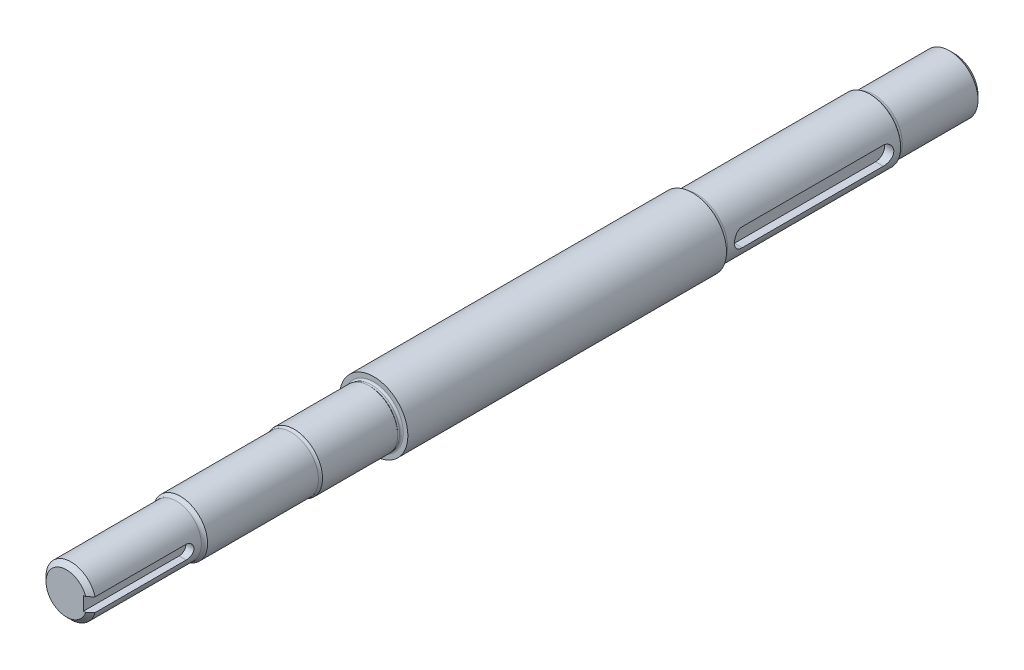
ISO-10303-21;
HEADER;
FILE_DESCRIPTION(('STEP AP214'),'2;1');
FILE_NAME('part.step','',(''),(''),'','','');
FILE_SCHEMA(('AUTOMOTIVE_DESIGN { 1 0 10303 214 1 1 1 1 }'));
ENDSEC;
DATA;
#1=APPLICATION_CONTEXT('core data for automotive mechanical design processes');
#2=APPLICATION_PROTOCOL_DEFINITION('international standard','automotive_design',2000,#1);
#3=PRODUCT_CONTEXT('',#1,'mechanical');
#4=PRODUCT('Part','Part','',(#3));
#5=PRODUCT_RELATED_PRODUCT_CATEGORY('part','',(#4));
#6=PRODUCT_DEFINITION_FORMATION('','',#4);
#7=PRODUCT_DEFINITION_CONTEXT('part definition',#1,'design');
#8=PRODUCT_DEFINITION('design','',#6,#7);
#9=PRODUCT_DEFINITION_SHAPE('','',#8);
#10=(LENGTH_UNIT() NAMED_UNIT(*) SI_UNIT(.MILLI.,.METRE.));
#11=(NAMED_UNIT(*) PLANE_ANGLE_UNIT() SI_UNIT($,.RADIAN.));
#12=(NAMED_UNIT(*) SI_UNIT($,.STERADIAN.) SOLID_ANGLE_UNIT());
#13=UNCERTAINTY_MEASURE_WITH_UNIT(LENGTH_MEASURE(1.E-05),#10,'distance_accuracy_value','');
#14=(GEOMETRIC_REPRESENTATION_CONTEXT(3) GLOBAL_UNCERTAINTY_ASSIGNED_CONTEXT((#13)) GLOBAL_UNIT_ASSIGNED_CONTEXT((#10,
#11,#12)) REPRESENTATION_CONTEXT('',''));
#15=CARTESIAN_POINT('',(0.,0.,0.));
#16=DIRECTION('',(0.,0.,1.));
#17=DIRECTION('',(1.,0.,0.));
#18=AXIS2_PLACEMENT_3D('',#15,#16,#17);
#19=CARTESIAN_POINT('',(0.,0.,55.0257761279498));
#20=DIRECTION('',(0.,0.,1.));
#21=DIRECTION('',(1.,0.,0.));
#22=AXIS2_PLACEMENT_3D('',#19,#20,#21);
#23=CYLINDRICAL_SURFACE('',#22,13.5);
#24=CARTESIAN_POINT('',(0.,0.,-78.));
#25=DIRECTION('',(0.,0.,1.));
#26=DIRECTION('',(1.,0.,0.));
#27=AXIS2_PLACEMENT_3D('',#24,#25,#26);
#28=CIRCLE('',#27,13.5);
#29=CARTESIAN_POINT('',(13.5,0.,-78.));
#30=VERTEX_POINT('',#29);
#31=EDGE_CURVE('E166',#30,#30,#28,.T.);
#32=ORIENTED_EDGE('',*,*,#31,.T.);
#33=EDGE_LOOP('',(#32));
#34=FACE_BOUND('',#33,.T.);
#35=CARTESIAN_POINT('',(0.,0.,-1.93649167310371));
#36=DIRECTION('',(0.,0.,1.));
#37=DIRECTION('',(1.,0.,0.));
#38=AXIS2_PLACEMENT_3D('',#35,#36,#37);
#39=CIRCLE('',#38,13.5);
#40=CARTESIAN_POINT('',(13.5,0.,-1.93649167310371));
#41=VERTEX_POINT('',#40);
#42=EDGE_CURVE('E196',#41,#41,#39,.F.);
#43=ORIENTED_EDGE('',*,*,#42,.T.);
#44=EDGE_LOOP('',(#43));
#45=FACE_BOUND('',#44,.T.);
#46=CARTESIAN_POINT('',(12.8937969582276,4.,-9.));
#47=CARTESIAN_POINT('',(12.8937818890467,4.00001363327408,-8.89015160940702));
#48=CARTESIAN_POINT('',(12.8952003886261,3.99547525485958,-8.78031190392703));
#49=CARTESIAN_POINT('',(12.9007925523032,3.97740052583399,-8.56146944046936));
#50=CARTESIAN_POINT('',(12.9049656097299,3.963866156519,-8.45246650354605));
#51=CARTESIAN_POINT('',(12.9159413533782,3.92795009186036,-8.23633695758211));
#52=CARTESIAN_POINT('',(12.9227374792287,3.90559046561189,-8.12920635899748));
#53=CARTESIAN_POINT('',(12.938740198391,3.85224250101991,-7.91732808904723));
#54=CARTESIAN_POINT('',(12.9479468522793,3.8212539458298,-7.81258047763807));
#55=CARTESIAN_POINT('',(12.9787846149915,3.71572195692426,-7.50306747123394));
#56=CARTESIAN_POINT('',(13.0036482787496,3.62856683195159,-7.30276181137516));
#57=CARTESIAN_POINT('',(13.059168323591,3.42335423184441,-6.91961864688014));
#58=CARTESIAN_POINT('',(13.0898273076745,3.30528286129112,-6.73678904748936));
#59=CARTESIAN_POINT('',(13.1545379431146,3.03768998510899,-6.38809764248146));
#60=CARTESIAN_POINT('',(13.1886601821433,2.88738591694147,-6.22284829349977));
#61=CARTESIAN_POINT('',(13.2558504173049,2.56127072097759,-5.91949510595916));
#62=CARTESIAN_POINT('',(13.2889182354368,2.38545531402757,-5.78139583059715));
#63=CARTESIAN_POINT('',(13.3510773480212,2.0089328586589,-5.53359318771718));
#64=CARTESIAN_POINT('',(13.3800752159103,1.80779605366471,-5.42451725885799));
#65=CARTESIAN_POINT('',(13.4300020991236,1.38903900909542,-5.2419811494105));
#66=CARTESIAN_POINT('',(13.4509331548432,1.17142295441695,-5.16851196134661));
#67=CARTESIAN_POINT('',(13.4818677892124,0.732329361139289,-5.06130347424422));
#68=CARTESIAN_POINT('',(13.4921603170544,0.511129552226032,-5.02651156597997));
#69=CARTESIAN_POINT('',(13.5016750417551,0.0658042710144583,-4.9943188424169));
#70=CARTESIAN_POINT('',(13.5008992779089,-0.158320654738506,-4.996911139207));
#71=CARTESIAN_POINT('',(13.4885695240992,-0.595747238406854,-5.03870386642479));
#72=CARTESIAN_POINT('',(13.4773512591613,-0.809168789670247,-5.07676405139718));
#73=CARTESIAN_POINT('',(13.4458037668001,-1.22644498886372,-5.18655212762667));
#74=CARTESIAN_POINT('',(13.4254740662495,-1.43029913938253,-5.25828176723797));
#75=CARTESIAN_POINT('',(13.3775199575839,-1.82539086636437,-5.43415441160498));
#76=CARTESIAN_POINT('',(13.3498144977493,-2.01645676960392,-5.5386600132546));
#77=CARTESIAN_POINT('',(13.2900527659609,-2.37870786968964,-5.77684091810776));
#78=CARTESIAN_POINT('',(13.2579955434421,-2.54988870779504,-5.91052259819434));
#79=CARTESIAN_POINT('',(13.1915480998773,-2.87428687768975,-6.20913838022941));
#80=CARTESIAN_POINT('',(13.1571154752687,-3.02658841033092,-6.3750574530887));
#81=CARTESIAN_POINT('',(13.0908337031004,-3.3015364301362,-6.73057476720772));
#82=CARTESIAN_POINT('',(13.0589853049243,-3.42417433560823,-6.92017983682974));
#83=CARTESIAN_POINT('',(13.0157897399104,-3.58361262895439,-7.21934881382489));
#84=CARTESIAN_POINT('',(13.0020935771246,-3.63286787668852,-7.32211945876548));
#85=CARTESIAN_POINT('',(12.9767157815759,-3.72250188311832,-7.53168669565672));
#86=CARTESIAN_POINT('',(12.9650333268141,-3.76288426558933,-7.63848162309145));
#87=CARTESIAN_POINT('',(12.94406745364,-3.83438476643873,-7.8552256452522));
#88=CARTESIAN_POINT('',(12.9347815157207,-3.86551261956977,-7.96517129129379));
#89=CARTESIAN_POINT('',(12.9188981806877,-3.91826834859925,-8.18746468258521));
#90=CARTESIAN_POINT('',(12.9122995421715,-3.93990061136203,-8.29981129340338));
#91=CARTESIAN_POINT('',(12.9027366742361,-3.97109856293948,-8.51008215555399));
#92=CARTESIAN_POINT('',(12.8993907636165,-3.98193697063141,-8.60780232838016));
#93=CARTESIAN_POINT('',(12.8949178002586,-3.99638652814826,-8.80367909224358));
#94=CARTESIAN_POINT('',(12.8937874509637,-4.00000841564135,-8.90183481676521));
#95=CARTESIAN_POINT('',(12.8937969582276,-4.,-9.));
#96=B_SPLINE_CURVE_WITH_KNOTS('',3,(#46,#47,#48,#49,#50,#51,#52,#53,#54,#55,#56,#57,#58,#59,#60,
#61,#62,#63,#64,#65,#66,#67,#68,#69,#70,#71,#72,#73,#74,#75,#76,#77,#78,#79,#80,#81,#82,#83,#84,
#85,#86,#87,#88,#89,#90,#91,#92,#93,#94,#95),.UNSPECIFIED.,.F.,.F.,(4,2,2,2,2,2,2,2,2,2,2,2,2,2,
2,2,2,2,2,2,2,2,2,2,4),(0.,0.329427496716697,0.658782463653813,0.987318986741055,
1.31586376675766,1.9721408488536,2.62871340489018,3.30352546254763,3.97845084117649,
4.6669598612901,5.35529461750422,6.02439905162094,6.69338020712454,7.34157014533766,
7.98979374584214,8.64545778900179,9.30126528144446,9.9816963040135,10.6623239405743,
11.0063214261948,11.3501781572491,11.6936718984076,12.0370067815693,12.3318506422402,
12.6262554676474),.UNSPECIFIED.);
#97=CARTESIAN_POINT('',(12.8937969582276,4.,-9.));
#98=VERTEX_POINT('',#97);
#99=CARTESIAN_POINT('',(12.8937969582276,-4.,-9.));
#100=VERTEX_POINT('',#99);
#101=EDGE_CURVE('E11',#98,#100,#96,.T.);
#102=ORIENTED_EDGE('',*,*,#101,.F.);
#103=DIRECTION('',(0.,0.,1.));
#104=VECTOR('',#103,1.);
#105=CARTESIAN_POINT('',(12.8937969582276,4.,55.0257761279498));
#106=LINE('',#105,#104);
#107=CARTESIAN_POINT('',(12.8937969582276,4.,-71.));
#108=VERTEX_POINT('',#107);
#109=EDGE_CURVE('E251',#108,#98,#106,.T.);
#110=ORIENTED_EDGE('',*,*,#109,.F.);
#111=CARTESIAN_POINT('',(12.8937969582276,-4.,-71.));
#112=CARTESIAN_POINT('',(12.8937818890467,-4.00001363327408,-71.109848390593));
#113=CARTESIAN_POINT('',(12.8952003886261,-3.99547525485958,-71.219688096073));
#114=CARTESIAN_POINT('',(12.9007925523032,-3.97740052583399,-71.4385305595307));
#115=CARTESIAN_POINT('',(12.9049656097299,-3.963866156519,-71.547533496454));
#116=CARTESIAN_POINT('',(12.9159413533782,-3.92795009186036,-71.7636630424179));
#117=CARTESIAN_POINT('',(12.9227374792287,-3.90559046561189,-71.8707936410025));
#118=CARTESIAN_POINT('',(12.938740198391,-3.85224250101991,-72.0826719109528));
#119=CARTESIAN_POINT('',(12.9479468522793,-3.8212539458298,-72.1874195223619));
#120=CARTESIAN_POINT('',(12.9787846149915,-3.71572195692426,-72.4969325287661));
#121=CARTESIAN_POINT('',(13.0036482787496,-3.6285668319516,-72.6972381886249));
#122=CARTESIAN_POINT('',(13.059168323591,-3.42335423184442,-73.0803813531198));
#123=CARTESIAN_POINT('',(13.0898273076745,-3.30528286129112,-73.2632109525106));
#124=CARTESIAN_POINT('',(13.1545379431146,-3.03768998510898,-73.6119023575185));
#125=CARTESIAN_POINT('',(13.1886601821433,-2.88738591694146,-73.7771517065002));
#126=CARTESIAN_POINT('',(13.2558504173049,-2.56127072097759,-74.0805048940409));
#127=CARTESIAN_POINT('',(13.2889182354368,-2.38545531402757,-74.2186041694029));
#128=CARTESIAN_POINT('',(13.3510773480212,-2.00893285865891,-74.4664068122828));
#129=CARTESIAN_POINT('',(13.3800752159103,-1.80779605366471,-74.575482741142));
#130=CARTESIAN_POINT('',(13.4300020991236,-1.38903900909541,-74.7580188505895));
#131=CARTESIAN_POINT('',(13.4509331548432,-1.17142295441695,-74.8314880386534));
#132=CARTESIAN_POINT('',(13.4818677892124,-0.732329361139282,-74.9386965257558));
#133=CARTESIAN_POINT('',(13.4921603170544,-0.511129552226024,-74.97348843402));
#134=CARTESIAN_POINT('',(13.5016750417551,-0.0658042710144511,-75.0056811575831));
#135=CARTESIAN_POINT('',(13.5008992779089,0.158320654738513,-75.003088860793));
#136=CARTESIAN_POINT('',(13.4885695240992,0.59574723840686,-74.9612961335752));
#137=CARTESIAN_POINT('',(13.4773512591613,0.809168789670254,-74.9232359486028));
#138=CARTESIAN_POINT('',(13.4458037668001,1.22644498886373,-74.8134478723733));
#139=CARTESIAN_POINT('',(13.4254740662495,1.43029913938254,-74.741718232762));
#140=CARTESIAN_POINT('',(13.3775199575839,1.82539086636438,-74.565845588395));
#141=CARTESIAN_POINT('',(13.3498144977493,2.01645676960393,-74.4613399867454));
#142=CARTESIAN_POINT('',(13.2900527659609,2.37870786968964,-74.2231590818922));
#143=CARTESIAN_POINT('',(13.2579955434421,2.54988870779505,-74.0894774018057));
#144=CARTESIAN_POINT('',(13.1915480998772,2.87428687768975,-73.7908616197706));
#145=CARTESIAN_POINT('',(13.1571154752687,3.02658841033092,-73.6249425469113));
#146=CARTESIAN_POINT('',(13.0908337031004,3.3015364301362,-73.2694252327923));
#147=CARTESIAN_POINT('',(13.0589853049243,3.42417433560823,-73.0798201631703));
#148=CARTESIAN_POINT('',(13.0157897399104,3.58361262895439,-72.7806511861751));
#149=CARTESIAN_POINT('',(13.0020935771246,3.63286787668852,-72.6778805412345));
#150=CARTESIAN_POINT('',(12.9767157815759,3.72250188311832,-72.4683133043433));
#151=CARTESIAN_POINT('',(12.9650333268141,3.76288426558933,-72.3615183769086));
#152=CARTESIAN_POINT('',(12.94406745364,3.83438476643874,-72.1447743547478));
#153=CARTESIAN_POINT('',(12.9347815157207,3.86551261956978,-72.0348287087062));
#154=CARTESIAN_POINT('',(12.9188981806877,3.91826834859925,-71.8125353174148));
#155=CARTESIAN_POINT('',(12.9122995421715,3.93990061136203,-71.7001887065966));
#156=CARTESIAN_POINT('',(12.9027366742361,3.97109856293949,-71.489917844446));
#157=CARTESIAN_POINT('',(12.8993907636165,3.98193697063141,-71.3921976716199));
#158=CARTESIAN_POINT('',(12.8949178002586,3.99638652814826,-71.1963209077564));
#159=CARTESIAN_POINT('',(12.8937874509637,4.00000841564135,-71.0981651832348));
#160=CARTESIAN_POINT('',(12.8937969582276,4.,-71.));
#161=B_SPLINE_CURVE_WITH_KNOTS('',3,(#111,#112,#113,#114,#115,#116,#117,#118,#119,#120,#121,
#122,#123,#124,#125,#126,#127,#128,#129,#130,#131,#132,#133,#134,#135,#136,#137,#138,#139,#140,
#141,#142,#143,#144,#145,#146,#147,#148,#149,#150,#151,#152,#153,#154,#155,#156,#157,#158,#159,
#160),.UNSPECIFIED.,.F.,.F.,(4,2,2,2,2,2,2,2,2,2,2,2,2,2,2,2,2,2,2,2,2,2,2,2,4),(0.,
0.329427496716703,0.658782463653815,0.987318986741052,1.31586376675767,1.97214084885358,
2.62871340489019,3.30352546254764,3.97845084117649,4.66695986129011,5.35529461750423,
6.02439905162095,6.69338020712455,7.34157014533767,7.98979374584215,8.6454577890018,
9.30126528144447,9.98169630401351,10.6623239405743,11.0063214261949,11.3501781572491,
11.6936718984076,12.0370067815693,12.3318506422402,12.6262554676474),.UNSPECIFIED.);
#162=CARTESIAN_POINT('',(12.8937969582276,-4.,-71.));
#163=VERTEX_POINT('',#162);
#164=EDGE_CURVE('E297',#163,#108,#161,.T.);
#165=ORIENTED_EDGE('',*,*,#164,.F.);
#166=DIRECTION('',(0.,0.,1.));
#167=VECTOR('',#166,1.);
#168=CARTESIAN_POINT('',(12.8937969582276,-4.,55.0257761279498));
#169=LINE('',#168,#167);
#170=EDGE_CURVE('E48',#100,#163,#169,.F.);
#171=ORIENTED_EDGE('',*,*,#170,.F.);
#172=EDGE_LOOP('',(#102,#110,#165,#171));
#173=FACE_BOUND('',#172,.T.);
#174=ADVANCED_FACE('F35',(#34,#45,#173),#23,.T.);
#175=CARTESIAN_POINT('',(0.,0.,275.));
#176=DIRECTION('',(0.,0.,-1.));
#177=DIRECTION('',(-1.,0.,0.));
#178=AXIS2_PLACEMENT_3D('',#175,#176,#177);
#179=PLANE('',#178);
#180=DIRECTION('',(-1.,0.,0.));
#181=VECTOR('',#180,1.);
#182=CARTESIAN_POINT('',(24.5,-3.,275.));
#183=LINE('',#182,#181);
#184=CARTESIAN_POINT('',(8.48528137423858,-3.,275.));
#185=VERTEX_POINT('',#184);
#186=CARTESIAN_POINT('',(7.5,-3.,275.));
#187=VERTEX_POINT('',#186);
#188=EDGE_CURVE('E160',#185,#187,#183,.T.);
#189=ORIENTED_EDGE('',*,*,#188,.T.);
#190=DIRECTION('',(0.,-1.,0.));
#191=VECTOR('',#190,1.);
#192=CARTESIAN_POINT('',(7.5,3.,275.));
#193=LINE('',#192,#191);
#194=CARTESIAN_POINT('',(7.5,3.,275.));
#195=VERTEX_POINT('',#194);
#196=EDGE_CURVE('E120',#195,#187,#193,.T.);
#197=ORIENTED_EDGE('',*,*,#196,.F.);
#198=DIRECTION('',(-1.,0.,0.));
#199=VECTOR('',#198,1.);
#200=CARTESIAN_POINT('',(24.5,3.,275.));
#201=LINE('',#200,#199);
#202=CARTESIAN_POINT('',(8.48528137423858,3.,275.));
#203=VERTEX_POINT('',#202);
#204=EDGE_CURVE('E154',#203,#195,#201,.T.);
#205=ORIENTED_EDGE('',*,*,#204,.F.);
#206=CARTESIAN_POINT('',(0.,0.,275.));
#207=DIRECTION('',(0.,0.,-1.));
#208=DIRECTION('',(-1.,0.,0.));
#209=AXIS2_PLACEMENT_3D('',#206,#207,#208);
#210=CIRCLE('',#209,9.00000000000001);
#211=EDGE_CURVE('E205',#203,#185,#210,.F.);
#212=ORIENTED_EDGE('',*,*,#211,.T.);
#213=EDGE_LOOP('',(#189,#197,#205,#212));
#214=FACE_BOUND('',#213,.T.);
#215=ADVANCED_FACE('F258',(#214),#179,.F.);
#216=CARTESIAN_POINT('',(0.,0.,55.0257761279498));
#217=DIRECTION('',(0.,0.,1.));
#218=DIRECTION('',(1.,0.,0.));
#219=AXIS2_PLACEMENT_3D('',#216,#217,#218);
#220=CYLINDRICAL_SURFACE('',#219,11.);
#221=CARTESIAN_POINT('',(0.,0.,226.732050807569));
#222=DIRECTION('',(0.,0.,-1.));
#223=DIRECTION('',(-1.,0.,0.));
#224=AXIS2_PLACEMENT_3D('',#221,#222,#223);
#225=CIRCLE('',#224,11.);
#226=CARTESIAN_POINT('',(-11.,0.,226.732050807569));
#227=VERTEX_POINT('',#226);
#228=EDGE_CURVE('E202',#227,#227,#225,.F.);
#229=ORIENTED_EDGE('',*,*,#228,.T.);
#230=EDGE_LOOP('',(#229));
#231=FACE_BOUND('',#230,.T.);
#232=DIRECTION('',(0.,0.,1.));
#233=VECTOR('',#232,1.);
#234=CARTESIAN_POINT('',(10.5830052442584,-3.,55.0257761279498));
#235=LINE('',#234,#233);
#236=CARTESIAN_POINT('',(10.5830052442584,-3.,273.));
#237=VERTEX_POINT('',#236);
#238=CARTESIAN_POINT('',(10.5830052442584,-3.,233.));
#239=VERTEX_POINT('',#238);
#240=EDGE_CURVE('E164',#237,#239,#235,.F.);
#241=ORIENTED_EDGE('',*,*,#240,.F.);
#242=CARTESIAN_POINT('',(0.,0.,273.));
#243=DIRECTION('',(0.,0.,-1.));
#244=DIRECTION('',(-1.,0.,0.));
#245=AXIS2_PLACEMENT_3D('',#242,#243,#244);
#246=CIRCLE('',#245,11.);
#247=CARTESIAN_POINT('',(10.5830052442584,3.,273.));
#248=VERTEX_POINT('',#247);
#249=EDGE_CURVE('E208',#237,#248,#246,.T.);
#250=ORIENTED_EDGE('',*,*,#249,.T.);
#251=DIRECTION('',(0.,0.,1.));
#252=VECTOR('',#251,1.);
#253=CARTESIAN_POINT('',(10.5830052442584,3.,55.0257761279498));
#254=LINE('',#253,#252);
#255=CARTESIAN_POINT('',(10.5830052442584,3.,233.));
#256=VERTEX_POINT('',#255);
#257=EDGE_CURVE('E63',#256,#248,#254,.T.);
#258=ORIENTED_EDGE('',*,*,#257,.F.);
#259=CARTESIAN_POINT('',(10.5830052442584,-3.,233.));
#260=CARTESIAN_POINT('',(10.5829949970026,-3.00000989976809,232.91730610859));
#261=CARTESIAN_POINT('',(10.5839742471726,-2.99658102723594,232.834618295408));
#262=CARTESIAN_POINT('',(10.5878356752194,-2.98292268314841,232.669866433771));
#263=CARTESIAN_POINT('',(10.5907174869552,-2.97269452008914,232.587802268371));
#264=CARTESIAN_POINT('',(10.598299618142,-2.94554459027321,232.425057487855));
#265=CARTESIAN_POINT('',(10.6029958951229,-2.9286377012691,232.344374210614));
#266=CARTESIAN_POINT('',(10.6140571066224,-2.88829120712689,232.184796745946));
#267=CARTESIAN_POINT('',(10.6204220728906,-2.8648514776895,232.105902592592));
#268=CARTESIAN_POINT('',(10.6417494872311,-2.78500332821793,231.872757092836));
#269=CARTESIAN_POINT('',(10.6589535681767,-2.71903526586306,231.721860605145));
#270=CARTESIAN_POINT('',(10.6973836998985,-2.56365897700124,231.433294658231));
#271=CARTESIAN_POINT('',(10.7186111730806,-2.4742424563657,231.295629902896));
#272=CARTESIAN_POINT('',(10.7633148792344,-2.27200424315805,231.033790294021));
#273=CARTESIAN_POINT('',(10.7868322128172,-2.15868225262836,230.910008121756));
#274=CARTESIAN_POINT('',(10.8331129950831,-1.91292298422354,230.682948561095));
#275=CARTESIAN_POINT('',(10.8558763200935,-1.78048258944452,230.579674522707));
#276=CARTESIAN_POINT('',(10.8985459264206,-1.49749198480951,230.394901093254));
#277=CARTESIAN_POINT('',(10.9183977479742,-1.34667477161622,230.313796920179));
#278=CARTESIAN_POINT('',(10.9525311229674,-1.03291980522385,230.17825158622));
#279=CARTESIAN_POINT('',(10.9668139185607,-0.869984764533394,230.123804478868));
#280=CARTESIAN_POINT('',(10.9879090070619,-0.54074467589672,230.044398265097));
#281=CARTESIAN_POINT('',(10.9948916417093,-0.374613167612536,230.018765673631));
#282=CARTESIAN_POINT('',(11.0011960589752,-0.0402673813620227,229.995595335153));
#283=CARTESIAN_POINT('',(11.0005190152883,0.127946573564692,229.998053283822));
#284=CARTESIAN_POINT('',(10.9917041066205,0.456980924404252,230.030524875815));
#285=CARTESIAN_POINT('',(10.9837634920705,0.617879308918082,230.059810026773));
#286=CARTESIAN_POINT('',(10.9615477415639,0.932383527853141,230.143925215859));
#287=CARTESIAN_POINT('',(10.9472722986892,1.08598900853898,230.198756491685));
#288=CARTESIAN_POINT('',(10.9137016176963,1.38338788045077,230.332954866807));
#289=CARTESIAN_POINT('',(10.8943563157114,1.52706425574145,230.412568246239));
#290=CARTESIAN_POINT('',(10.8527253375081,1.79926098198644,230.593879869907));
#291=CARTESIAN_POINT('',(10.830439121215,1.92777854091954,230.695582172812));
#292=CARTESIAN_POINT('',(10.7844948742978,2.1703484411203,230.922023235084));
#293=CARTESIAN_POINT('',(10.760815765188,2.28380693028891,231.047394553869));
#294=CARTESIAN_POINT('',(10.7153886222241,2.48826234185507,231.31566238087));
#295=CARTESIAN_POINT('',(10.6936411271564,2.57925300980783,231.458563752454));
#296=CARTESIAN_POINT('',(10.6544469945807,2.73667910615422,231.759194812754));
#297=CARTESIAN_POINT('',(10.6370325899538,2.80293223890786,231.917024242757));
#298=CARTESIAN_POINT('',(10.6088816209578,2.90768324325781,232.242087094527));
#299=CARTESIAN_POINT('',(10.598135003286,2.94622291362359,232.409305942275));
#300=CARTESIAN_POINT('',(10.588613232355,2.98015870664207,232.648354439867));
#301=CARTESIAN_POINT('',(10.5865140551644,2.98759962141261,232.718516459724));
#302=CARTESIAN_POINT('',(10.58371035186,2.99751512863222,232.85910755324));
#303=CARTESIAN_POINT('',(10.5830036423878,2.99999749605757,232.929536035058));
#304=CARTESIAN_POINT('',(10.5830052442584,3.,233.));
#305=B_SPLINE_CURVE_WITH_KNOTS('',3,(#259,#260,#261,#262,#263,#264,#265,#266,#267,#268,#269,
#270,#271,#272,#273,#274,#275,#276,#277,#278,#279,#280,#281,#282,#283,#284,#285,#286,#287,#288,
#289,#290,#291,#292,#293,#294,#295,#296,#297,#298,#299,#300,#301,#302,#303,#304),.UNSPECIFIED.,
.F.,.F.,(4,2,2,2,2,2,2,2,2,2,2,2,2,2,2,2,2,2,2,2,2,2,4),(0.,0.247994395628672,0.49594107954413,
0.743338515979064,0.99074065992621,1.48499724217186,1.97942888795734,2.4854708385663,
2.99159538337129,3.5062279498187,4.02074566333959,4.52296979924473,5.02511698025349,
5.51402000992994,6.00294672920887,6.49689640600091,6.99093691914145,7.5007728603322,
8.01075056671348,8.52441550873709,9.0373040824346,9.24891043373582,9.46018472611218),.UNSPECIFIED.);
#306=EDGE_CURVE('E245',#239,#256,#305,.T.);
#307=ORIENTED_EDGE('',*,*,#306,.F.);
#308=EDGE_LOOP('',(#241,#250,#258,#307));
#309=FACE_BOUND('',#308,.T.);
#310=ADVANCED_FACE('F253',(#231,#309),#220,.T.);
#311=CARTESIAN_POINT('',(0.,0.,275.));
#312=DIRECTION('',(0.,0.,-1.));
#313=DIRECTION('',(-1.,0.,0.));
#314=AXIS2_PLACEMENT_3D('',#311,#312,#313);
#315=CONICAL_SURFACE('',#314,9.00000000000001,0.785398163397446);
#316=ORIENTED_EDGE('',*,*,#249,.F.);
#317=CARTESIAN_POINT('',(14.6010398199037,-3.,269.093948751517));
#318=CARTESIAN_POINT('',(14.1292841686277,-3.,269.555992450514));
#319=CARTESIAN_POINT('',(13.6571289979455,-3.,270.017630882768));
#320=CARTESIAN_POINT('',(12.7116427281132,-3.,270.9395859318));
#321=CARTESIAN_POINT('',(12.238311779561,-3.,271.399902703069));
#322=CARTESIAN_POINT('',(11.2903136407249,-3.,272.318494919134));
#323=CARTESIAN_POINT('',(10.8156476162057,-3.,272.776771566228));
#324=CARTESIAN_POINT('',(9.86385274623317,-3.,273.690886824237));
#325=CARTESIAN_POINT('',(9.38672359603954,-3.,274.146725118546));
#326=CARTESIAN_POINT('',(8.66799184122547,-3.,274.827851279416));
#327=CARTESIAN_POINT('',(8.42776399271856,-3.,275.054589299639));
#328=CARTESIAN_POINT('',(7.94613916374821,-3.,275.506812575008));
#329=CARTESIAN_POINT('',(7.70474220474104,-3.,275.732297852982));
#330=CARTESIAN_POINT('',(7.2205190064585,-3.,276.181577000661));
#331=CARTESIAN_POINT('',(6.97769324030069,-3.,276.405371379748));
#332=CARTESIAN_POINT('',(6.49004737903656,-3.,276.85081509121));
#333=CARTESIAN_POINT('',(6.24522714776448,-3.,277.07246427483));
#334=CARTESIAN_POINT('',(5.75264020820911,-3.,277.513035322516));
#335=CARTESIAN_POINT('',(5.50487047183551,-3.,277.731953806591));
#336=CARTESIAN_POINT('',(5.00566960215203,-3.,278.165507092452));
#337=CARTESIAN_POINT('',(4.75423917406872,-3.,278.380142700924));
#338=CARTESIAN_POINT('',(4.37293289291259,-3.,278.69739460769));
#339=CARTESIAN_POINT('',(4.24506334732131,-3.,278.802420131453));
#340=CARTESIAN_POINT('',(3.9876825490498,-3.,279.010425948509));
#341=CARTESIAN_POINT('',(3.85817140993323,-3.,279.113406382027));
#342=CARTESIAN_POINT('',(3.59703732045707,-3.,279.316842461265));
#343=CARTESIAN_POINT('',(3.46541306262269,-3.,279.417296436697));
#344=CARTESIAN_POINT('',(3.26607227263148,-3.,279.565447416242));
#345=CARTESIAN_POINT('',(3.19929989028001,-3.,279.614415083445));
#346=CARTESIAN_POINT('',(3.06504268300879,-3.,279.71137095355));
#347=CARTESIAN_POINT('',(2.99755781940343,-3.,279.759359102848));
#348=CARTESIAN_POINT('',(2.929679048087,-3.,279.80678890052));
#349=B_SPLINE_CURVE_WITH_KNOTS('',3,(#317,#318,#319,#320,#321,#322,#323,#324,#325,#326,#327,
#328,#329,#330,#331,#332,#333,#334,#335,#336,#337,#338,#339,#340,#341,#342,#343,#344,#345,#346,
#347,#348),.UNSPECIFIED.,.F.,.F.,(4,2,2,2,2,2,2,2,2,2,2,2,2,2,2,4),(0.,1.98099734804656,
3.96175285011267,5.94112334622808,7.9207448994624,8.91173908662,9.90271515480899,
10.8933797288311,11.8841125137907,12.8759694582458,13.8676377870236,14.3640376958447,
14.8604034496733,15.3570891645226,15.6054910938729,15.8539065807921),.UNSPECIFIED.);
#350=EDGE_CURVE('E223',#237,#185,#349,.T.);
#351=ORIENTED_EDGE('',*,*,#350,.T.);
#352=ORIENTED_EDGE('',*,*,#211,.F.);
#353=CARTESIAN_POINT('',(2.929679048087,3.,279.80678890052));
#354=CARTESIAN_POINT('',(3.0140628412195,3.,279.747821201114));
#355=CARTESIAN_POINT('',(3.09784007496472,3.,279.687996829255));
#356=CARTESIAN_POINT('',(3.26432015656924,3.,279.566885514982));
#357=CARTESIAN_POINT('',(3.3470231001785,3.,279.505598704313));
#358=CARTESIAN_POINT('',(3.5936946965363,3.,279.319947014383));
#359=CARTESIAN_POINT('',(3.756283773362,3.,279.193750108139));
#360=CARTESIAN_POINT('',(4.07850876170263,3.,278.937918015673));
#361=CARTESIAN_POINT('',(4.23814688227858,3.,278.808285594165));
#362=CARTESIAN_POINT('',(4.55524236389575,3.,278.546354176447));
#363=CARTESIAN_POINT('',(4.71269950456742,3.,278.414054914044));
#364=CARTESIAN_POINT('',(5.0256910176431,3.,278.14757763534));
#365=CARTESIAN_POINT('',(5.18122744187176,3.,278.013402023291));
#366=CARTESIAN_POINT('',(5.4909036680721,3.,277.743461841425));
#367=CARTESIAN_POINT('',(5.6450435186597,3.,277.607697327299));
#368=CARTESIAN_POINT('',(5.95222462176884,3.,277.33486692436));
#369=CARTESIAN_POINT('',(6.10526563301006,3.,277.197800764209));
#370=CARTESIAN_POINT('',(6.41041682470184,3.,276.922634855661));
#371=CARTESIAN_POINT('',(6.5625269982338,3.,276.784535099598));
#372=CARTESIAN_POINT('',(6.89880381901511,3.,276.477512321327));
#373=CARTESIAN_POINT('',(7.08278467934464,3.,276.308385909418));
#374=CARTESIAN_POINT('',(7.44980505886476,3.,275.969140859845));
#375=CARTESIAN_POINT('',(7.63284464172042,3.,275.799022290994));
#376=CARTESIAN_POINT('',(7.99822373157198,3.,275.457910532166));
#377=CARTESIAN_POINT('',(8.18056297792564,3.,275.286917063144));
#378=CARTESIAN_POINT('',(8.54460922134822,3.,274.94425109298));
#379=CARTESIAN_POINT('',(8.72631620497282,3.,274.772578577563));
#380=CARTESIAN_POINT('',(9.38708290619876,3.,274.146384593682));
#381=CARTESIAN_POINT('',(9.8645689559312,3.,273.69020266601));
#382=CARTESIAN_POINT('',(10.8171356468106,3.,272.775338778775));
#383=CARTESIAN_POINT('',(11.2922162846867,3.,272.316656815816));
#384=CARTESIAN_POINT('',(12.240271821902,3.,271.397997877954));
#385=CARTESIAN_POINT('',(12.7132482616141,3.,270.938022491749));
#386=CARTESIAN_POINT('',(13.6579627148665,3.,270.016815864797));
#387=CARTESIAN_POINT('',(14.1297007473941,3.,269.555584643529));
#388=CARTESIAN_POINT('',(14.6010398199037,3.,269.093948751517));
#389=B_SPLINE_CURVE_WITH_KNOTS('',3,(#353,#354,#355,#356,#357,#358,#359,#360,#361,#362,#363,
#364,#365,#366,#367,#368,#369,#370,#371,#372,#373,#374,#375,#376,#377,#378,#379,#380,#381,#382,
#383,#384,#385,#386,#387,#388),.UNSPECIFIED.,.F.,.F.,(4,2,2,2,2,2,2,2,2,2,2,2,2,2,2,2,2,4),(0.,
0.308821886400506,0.617616056425763,1.2349926470799,1.85188665217059,2.46884254103966,
3.08506954624755,3.70127501700174,4.31761189075535,4.93395333997052,5.68366462984061,
6.43332452644205,7.18324063163286,7.93317258664629,9.91427992267566,11.8953899517958,
13.8746689786376,15.8539174798843),.UNSPECIFIED.);
#390=EDGE_CURVE('E217',#203,#248,#389,.T.);
#391=ORIENTED_EDGE('',*,*,#390,.T.);
#392=EDGE_LOOP('',(#316,#351,#352,#391));
#393=FACE_BOUND('',#392,.T.);
#394=ADVANCED_FACE('F229',(#393),#315,.T.);
#395=CARTESIAN_POINT('',(0.,0.,55.0257761279498));
#396=DIRECTION('',(0.,0.,1.));
#397=DIRECTION('',(1.,0.,0.));
#398=AXIS2_PLACEMENT_3D('',#395,#396,#397);
#399=CYLINDRICAL_SURFACE('',#398,12.);
#400=CARTESIAN_POINT('',(0.,0.,176.322875655532));
#401=DIRECTION('',(0.,0.,-1.));
#402=DIRECTION('',(-1.,0.,0.));
#403=AXIS2_PLACEMENT_3D('',#400,#401,#402);
#404=CIRCLE('',#403,12.);
#405=CARTESIAN_POINT('',(-12.,0.,176.322875655532));
#406=VERTEX_POINT('',#405);
#407=EDGE_CURVE('E199',#406,#406,#404,.F.);
#408=ORIENTED_EDGE('',*,*,#407,.T.);
#409=EDGE_LOOP('',(#408));
#410=FACE_BOUND('',#409,.T.);
#411=CARTESIAN_POINT('',(0.,0.,225.));
#412=DIRECTION('',(0.,0.,1.));
#413=DIRECTION('',(1.,0.,0.));
#414=AXIS2_PLACEMENT_3D('',#411,#412,#413);
#415=CIRCLE('',#414,12.);
#416=CARTESIAN_POINT('',(12.,0.,225.));
#417=VERTEX_POINT('',#416);
#418=EDGE_CURVE('E190',#417,#417,#415,.T.);
#419=ORIENTED_EDGE('',*,*,#418,.F.);
#420=EDGE_LOOP('',(#419));
#421=FACE_BOUND('',#420,.T.);
#422=ADVANCED_FACE('F260',(#410,#421),#399,.T.);
#423=CARTESIAN_POINT('',(0.,0.,55.0257761279498));
#424=DIRECTION('',(0.,0.,1.));
#425=DIRECTION('',(1.,0.,0.));
#426=AXIS2_PLACEMENT_3D('',#423,#424,#425);
#427=CYLINDRICAL_SURFACE('',#426,12.5);
#428=CARTESIAN_POINT('',(0.,0.,175.));
#429=DIRECTION('',(0.,0.,1.));
#430=DIRECTION('',(1.,0.,0.));
#431=AXIS2_PLACEMENT_3D('',#428,#429,#430);
#432=CIRCLE('',#431,12.5);
#433=CARTESIAN_POINT('',(12.5,0.,175.));
#434=VERTEX_POINT('',#433);
#435=EDGE_CURVE('E187',#434,#434,#432,.T.);
#436=ORIENTED_EDGE('',*,*,#435,.F.);
#437=EDGE_LOOP('',(#436));
#438=FACE_BOUND('',#437,.T.);
#439=CARTESIAN_POINT('',(0.,0.,142.));
#440=DIRECTION('',(0.,0.,1.));
#441=DIRECTION('',(1.,0.,0.));
#442=AXIS2_PLACEMENT_3D('',#439,#440,#441);
#443=CIRCLE('',#442,12.5);
#444=CARTESIAN_POINT('',(12.5,0.,142.));
#445=VERTEX_POINT('',#444);
#446=EDGE_CURVE('E184',#445,#445,#443,.T.);
#447=ORIENTED_EDGE('',*,*,#446,.T.);
#448=EDGE_LOOP('',(#447));
#449=FACE_BOUND('',#448,.T.);
#450=ADVANCED_FACE('F336',(#438,#449),#427,.T.);
#451=CARTESIAN_POINT('',(0.,0.,141.7));
#452=DIRECTION('',(0.,0.,1.));
#453=DIRECTION('',(1.,0.,0.));
#454=AXIS2_PLACEMENT_3D('',#451,#452,#453);
#455=CONICAL_SURFACE('',#454,12.2,0.785398163397457);
#456=ORIENTED_EDGE('',*,*,#446,.F.);
#457=EDGE_LOOP('',(#456));
#458=FACE_BOUND('',#457,.T.);
#459=CARTESIAN_POINT('',(0.,0.,141.7));
#460=DIRECTION('',(0.,0.,1.));
#461=DIRECTION('',(1.,0.,0.));
#462=AXIS2_PLACEMENT_3D('',#459,#460,#461);
#463=CIRCLE('',#462,12.2);
#464=CARTESIAN_POINT('',(12.2,0.,141.7));
#465=VERTEX_POINT('',#464);
#466=EDGE_CURVE('E181',#465,#465,#463,.T.);
#467=ORIENTED_EDGE('',*,*,#466,.T.);
#468=EDGE_LOOP('',(#467));
#469=FACE_BOUND('',#468,.T.);
#470=ADVANCED_FACE('F341',(#458,#469),#455,.T.);
#471=CARTESIAN_POINT('',(0.,0.,55.0257761279498));
#472=DIRECTION('',(0.,0.,1.));
#473=DIRECTION('',(1.,0.,0.));
#474=AXIS2_PLACEMENT_3D('',#471,#472,#473);
#475=CYLINDRICAL_SURFACE('',#474,12.2);
#476=ORIENTED_EDGE('',*,*,#466,.F.);
#477=EDGE_LOOP('',(#476));
#478=FACE_BOUND('',#477,.T.);
#479=CARTESIAN_POINT('',(0.,0.,140.8));
#480=DIRECTION('',(0.,0.,1.));
#481=DIRECTION('',(1.,0.,0.));
#482=AXIS2_PLACEMENT_3D('',#479,#480,#481);
#483=CIRCLE('',#482,12.2);
#484=CARTESIAN_POINT('',(12.2,0.,140.8));
#485=VERTEX_POINT('',#484);
#486=EDGE_CURVE('E178',#485,#485,#483,.T.);
#487=ORIENTED_EDGE('',*,*,#486,.T.);
#488=EDGE_LOOP('',(#487));
#489=FACE_BOUND('',#488,.T.);
#490=ADVANCED_FACE('F350',(#478,#489),#475,.T.);
#491=CARTESIAN_POINT('',(0.,0.,140.8));
#492=DIRECTION('',(0.,0.,1.));
#493=DIRECTION('',(1.,0.,0.));
#494=AXIS2_PLACEMENT_3D('',#491,#492,#493);
#495=TOROIDAL_SURFACE('',#494,13.,0.799999999999998);
#496=ORIENTED_EDGE('',*,*,#486,.F.);
#497=EDGE_LOOP('',(#496));
#498=FACE_BOUND('',#497,.T.);
#499=CARTESIAN_POINT('',(0.,0.,140.));
#500=DIRECTION('',(0.,0.,1.));
#501=DIRECTION('',(1.,0.,0.));
#502=AXIS2_PLACEMENT_3D('',#499,#500,#501);
#503=CIRCLE('',#502,13.);
#504=CARTESIAN_POINT('',(13.,0.,140.));
#505=VERTEX_POINT('',#504);
#506=EDGE_CURVE('E175',#505,#505,#503,.T.);
#507=ORIENTED_EDGE('',*,*,#506,.T.);
#508=EDGE_LOOP('',(#507));
#509=FACE_BOUND('',#508,.T.);
#510=ADVANCED_FACE('F358',(#498,#509),#495,.F.);
#511=CARTESIAN_POINT('',(0.,13.,140.));
#512=DIRECTION('',(0.,0.,-1.));
#513=DIRECTION('',(-1.,0.,0.));
#514=AXIS2_PLACEMENT_3D('',#511,#512,#513);
#515=PLANE('',#514);
#516=ORIENTED_EDGE('',*,*,#506,.F.);
#517=EDGE_LOOP('',(#516));
#518=FACE_BOUND('',#517,.T.);
#519=CARTESIAN_POINT('',(0.,0.,140.));
#520=DIRECTION('',(0.,0.,1.));
#521=DIRECTION('',(1.,0.,0.));
#522=AXIS2_PLACEMENT_3D('',#519,#520,#521);
#523=CIRCLE('',#522,15.);
#524=CARTESIAN_POINT('',(15.,0.,140.));
#525=VERTEX_POINT('',#524);
#526=EDGE_CURVE('E172',#525,#525,#523,.T.);
#527=ORIENTED_EDGE('',*,*,#526,.T.);
#528=EDGE_LOOP('',(#527));
#529=FACE_BOUND('',#528,.T.);
#530=ADVANCED_FACE('F361',(#518,#529),#515,.F.);
#531=CARTESIAN_POINT('',(0.,0.,55.0257761279498));
#532=DIRECTION('',(0.,0.,1.));
#533=DIRECTION('',(1.,0.,0.));
#534=AXIS2_PLACEMENT_3D('',#531,#532,#533);
#535=CYLINDRICAL_SURFACE('',#534,15.);
#536=ORIENTED_EDGE('',*,*,#526,.F.);
#537=EDGE_LOOP('',(#536));
#538=FACE_BOUND('',#537,.T.);
#539=CARTESIAN_POINT('',(0.,0.,0.));
#540=DIRECTION('',(0.,0.,1.));
#541=DIRECTION('',(1.,0.,0.));
#542=AXIS2_PLACEMENT_3D('',#539,#540,#541);
#543=CIRCLE('',#542,15.);
#544=CARTESIAN_POINT('',(15.,0.,0.));
#545=VERTEX_POINT('',#544);
#546=EDGE_CURVE('E169',#545,#545,#543,.T.);
#547=ORIENTED_EDGE('',*,*,#546,.T.);
#548=EDGE_LOOP('',(#547));
#549=FACE_BOUND('',#548,.T.);
#550=ADVANCED_FACE('F294',(#538,#549),#535,.T.);
#551=CARTESIAN_POINT('',(0.,0.,55.0257761279498));
#552=DIRECTION('',(0.,0.,1.));
#553=DIRECTION('',(1.,0.,0.));
#554=AXIS2_PLACEMENT_3D('',#551,#552,#553);
#555=CYLINDRICAL_SURFACE('',#554,12.5);
#556=CARTESIAN_POINT('',(0.,0.,-113.));
#557=DIRECTION('',(0.,0.,1.));
#558=DIRECTION('',(1.,0.,0.));
#559=AXIS2_PLACEMENT_3D('',#556,#557,#558);
#560=CIRCLE('',#559,12.5);
#561=CARTESIAN_POINT('',(12.5,0.,-113.));
#562=VERTEX_POINT('',#561);
#563=EDGE_CURVE('E211',#562,#562,#560,.T.);
#564=ORIENTED_EDGE('',*,*,#563,.T.);
#565=EDGE_LOOP('',(#564));
#566=FACE_BOUND('',#565,.T.);
#567=CARTESIAN_POINT('',(0.,0.,-79.7320508075688));
#568=DIRECTION('',(0.,0.,1.));
#569=DIRECTION('',(1.,0.,0.));
#570=AXIS2_PLACEMENT_3D('',#567,#568,#569);
#571=CIRCLE('',#570,12.5);
#572=CARTESIAN_POINT('',(12.5,0.,-79.7320508075688));
#573=VERTEX_POINT('',#572);
#574=EDGE_CURVE('E193',#573,#573,#571,.F.);
#575=ORIENTED_EDGE('',*,*,#574,.T.);
#576=EDGE_LOOP('',(#575));
#577=FACE_BOUND('',#576,.T.);
#578=ADVANCED_FACE('F293',(#566,#577),#555,.T.);
#579=CARTESIAN_POINT('',(0.,12.5,-115.));
#580=DIRECTION('',(0.,0.,1.));
#581=DIRECTION('',(1.,0.,0.));
#582=AXIS2_PLACEMENT_3D('',#579,#580,#581);
#583=PLANE('',#582);
#584=CARTESIAN_POINT('',(0.,0.,-115.));
#585=DIRECTION('',(0.,0.,1.));
#586=DIRECTION('',(1.,0.,0.));
#587=AXIS2_PLACEMENT_3D('',#584,#585,#586);
#588=CIRCLE('',#587,10.5);
#589=CARTESIAN_POINT('',(10.5,0.,-115.));
#590=VERTEX_POINT('',#589);
#591=EDGE_CURVE('E214',#590,#590,#588,.F.);
#592=ORIENTED_EDGE('',*,*,#591,.T.);
#593=EDGE_LOOP('',(#592));
#594=FACE_BOUND('',#593,.T.);
#595=ADVANCED_FACE('F269',(#594),#583,.F.);
#596=CARTESIAN_POINT('',(0.,0.,-79.7320508075689));
#597=DIRECTION('',(0.,0.,1.));
#598=DIRECTION('',(1.,0.,0.));
#599=AXIS2_PLACEMENT_3D('',#596,#597,#598);
#600=TOROIDAL_SURFACE('',#599,14.5,2.);
#601=ORIENTED_EDGE('',*,*,#574,.F.);
#602=EDGE_LOOP('',(#601));
#603=FACE_BOUND('',#602,.T.);
#604=ORIENTED_EDGE('',*,*,#31,.F.);
#605=EDGE_LOOP('',(#604));
#606=FACE_BOUND('',#605,.T.);
#607=ADVANCED_FACE('F265',(#603,#606),#600,.F.);
#608=CARTESIAN_POINT('',(0.,0.,-1.93649167310371));
#609=DIRECTION('',(0.,0.,1.));
#610=DIRECTION('',(1.,0.,0.));
#611=AXIS2_PLACEMENT_3D('',#608,#609,#610);
#612=TOROIDAL_SURFACE('',#611,15.5,2.);
#613=ORIENTED_EDGE('',*,*,#42,.F.);
#614=EDGE_LOOP('',(#613));
#615=FACE_BOUND('',#614,.T.);
#616=ORIENTED_EDGE('',*,*,#546,.F.);
#617=EDGE_LOOP('',(#616));
#618=FACE_BOUND('',#617,.T.);
#619=ADVANCED_FACE('F268',(#615,#618),#612,.F.);
#620=CARTESIAN_POINT('',(0.,0.,176.322875655532));
#621=DIRECTION('',(0.,0.,-1.));
#622=DIRECTION('',(-1.,0.,0.));
#623=AXIS2_PLACEMENT_3D('',#620,#621,#622);
#624=TOROIDAL_SURFACE('',#623,14.,2.);
#625=ORIENTED_EDGE('',*,*,#435,.T.);
#626=EDGE_LOOP('',(#625));
#627=FACE_BOUND('',#626,.T.);
#628=ORIENTED_EDGE('',*,*,#407,.F.);
#629=EDGE_LOOP('',(#628));
#630=FACE_BOUND('',#629,.T.);
#631=ADVANCED_FACE('F273',(#627,#630),#624,.F.);
#632=CARTESIAN_POINT('',(0.,0.,226.732050807569));
#633=DIRECTION('',(0.,0.,-1.));
#634=DIRECTION('',(-1.,0.,0.));
#635=AXIS2_PLACEMENT_3D('',#632,#633,#634);
#636=TOROIDAL_SURFACE('',#635,13.,2.);
#637=ORIENTED_EDGE('',*,*,#418,.T.);
#638=EDGE_LOOP('',(#637));
#639=FACE_BOUND('',#638,.T.);
#640=ORIENTED_EDGE('',*,*,#228,.F.);
#641=EDGE_LOOP('',(#640));
#642=FACE_BOUND('',#641,.T.);
#643=ADVANCED_FACE('F276',(#639,#642),#636,.F.);
#644=CARTESIAN_POINT('',(0.,0.,-113.));
#645=DIRECTION('',(0.,0.,1.));
#646=DIRECTION('',(1.,0.,0.));
#647=AXIS2_PLACEMENT_3D('',#644,#645,#646);
#648=CONICAL_SURFACE('',#647,12.5,0.785398163397453);
#649=ORIENTED_EDGE('',*,*,#591,.F.);
#650=EDGE_LOOP('',(#649));
#651=FACE_BOUND('',#650,.T.);
#652=ORIENTED_EDGE('',*,*,#563,.F.);
#653=EDGE_LOOP('',(#652));
#654=FACE_BOUND('',#653,.T.);
#655=ADVANCED_FACE('F37',(#651,#654),#648,.T.);
#656=CARTESIAN_POINT('',(24.5,0.,233.));
#657=DIRECTION('',(-1.,0.,0.));
#658=DIRECTION('',(0.,0.,1.));
#659=AXIS2_PLACEMENT_3D('',#656,#657,#658);
#660=CYLINDRICAL_SURFACE('',#659,3.);
#661=ORIENTED_EDGE('',*,*,#306,.T.);
#662=DIRECTION('',(-1.,0.,0.));
#663=VECTOR('',#662,1.);
#664=CARTESIAN_POINT('',(24.5,3.,233.));
#665=LINE('',#664,#663);
#666=CARTESIAN_POINT('',(7.5,3.,233.));
#667=VERTEX_POINT('',#666);
#668=EDGE_CURVE('E156',#256,#667,#665,.T.);
#669=ORIENTED_EDGE('',*,*,#668,.T.);
#670=CARTESIAN_POINT('',(7.5,0.,233.));
#671=DIRECTION('',(1.,0.,0.));
#672=DIRECTION('',(0.,0.,-1.));
#673=AXIS2_PLACEMENT_3D('',#670,#671,#672);
#674=CIRCLE('',#673,3.);
#675=CARTESIAN_POINT('',(7.5,-3.,233.));
#676=VERTEX_POINT('',#675);
#677=EDGE_CURVE('E148',#676,#667,#674,.T.);
#678=ORIENTED_EDGE('',*,*,#677,.F.);
#679=DIRECTION('',(-1.,0.,0.));
#680=VECTOR('',#679,1.);
#681=CARTESIAN_POINT('',(24.5,-3.,233.));
#682=LINE('',#681,#680);
#683=EDGE_CURVE('E158',#239,#676,#682,.T.);
#684=ORIENTED_EDGE('',*,*,#683,.F.);
#685=EDGE_LOOP('',(#661,#669,#678,#684));
#686=FACE_BOUND('',#685,.T.);
#687=ADVANCED_FACE('F239',(#686),#660,.F.);
#688=CARTESIAN_POINT('',(24.5,-3.,275.));
#689=DIRECTION('',(0.,1.,0.));
#690=DIRECTION('',(0.,0.,1.));
#691=AXIS2_PLACEMENT_3D('',#688,#689,#690);
#692=PLANE('',#691);
#693=ORIENTED_EDGE('',*,*,#240,.T.);
#694=ORIENTED_EDGE('',*,*,#683,.T.);
#695=DIRECTION('',(0.,0.,-1.));
#696=VECTOR('',#695,1.);
#697=CARTESIAN_POINT('',(7.5,-3.,275.));
#698=LINE('',#697,#696);
#699=EDGE_CURVE('E145',#187,#676,#698,.T.);
#700=ORIENTED_EDGE('',*,*,#699,.F.);
#701=ORIENTED_EDGE('',*,*,#188,.F.);
#702=ORIENTED_EDGE('',*,*,#350,.F.);
#703=EDGE_LOOP('',(#693,#694,#700,#701,#702));
#704=FACE_BOUND('',#703,.T.);
#705=ADVANCED_FACE('F238',(#704),#692,.T.);
#706=CARTESIAN_POINT('',(24.5,3.,275.));
#707=DIRECTION('',(0.,-1.,0.));
#708=DIRECTION('',(0.,0.,-1.));
#709=AXIS2_PLACEMENT_3D('',#706,#707,#708);
#710=PLANE('',#709);
#711=ORIENTED_EDGE('',*,*,#257,.T.);
#712=ORIENTED_EDGE('',*,*,#390,.F.);
#713=ORIENTED_EDGE('',*,*,#204,.T.);
#714=DIRECTION('',(0.,0.,1.));
#715=VECTOR('',#714,1.);
#716=CARTESIAN_POINT('',(7.5,3.,275.));
#717=LINE('',#716,#715);
#718=EDGE_CURVE('E151',#667,#195,#717,.T.);
#719=ORIENTED_EDGE('',*,*,#718,.F.);
#720=ORIENTED_EDGE('',*,*,#668,.F.);
#721=EDGE_LOOP('',(#711,#712,#713,#719,#720));
#722=FACE_BOUND('',#721,.T.);
#723=ADVANCED_FACE('F232',(#722),#710,.T.);
#724=CARTESIAN_POINT('',(7.5,0.,233.));
#725=DIRECTION('',(1.,0.,0.));
#726=DIRECTION('',(0.,0.,-1.));
#727=AXIS2_PLACEMENT_3D('',#724,#725,#726);
#728=PLANE('',#727);
#729=ORIENTED_EDGE('',*,*,#196,.T.);
#730=ORIENTED_EDGE('',*,*,#699,.T.);
#731=ORIENTED_EDGE('',*,*,#677,.T.);
#732=ORIENTED_EDGE('',*,*,#718,.T.);
#733=EDGE_LOOP('',(#729,#730,#731,#732));
#734=FACE_BOUND('',#733,.T.);
#735=ADVANCED_FACE('F237',(#734),#728,.T.);
#736=CARTESIAN_POINT('',(60.5,0.,-9.));
#737=DIRECTION('',(-1.,0.,0.));
#738=DIRECTION('',(0.,0.,1.));
#739=AXIS2_PLACEMENT_3D('',#736,#737,#738);
#740=CYLINDRICAL_SURFACE('',#739,4.);
#741=ORIENTED_EDGE('',*,*,#101,.T.);
#742=DIRECTION('',(-1.,0.,0.));
#743=VECTOR('',#742,1.);
#744=CARTESIAN_POINT('',(60.5,-4.,-9.));
#745=LINE('',#744,#743);
#746=CARTESIAN_POINT('',(9.5,-4.,-9.));
#747=VERTEX_POINT('',#746);
#748=EDGE_CURVE('E111',#100,#747,#745,.T.);
#749=ORIENTED_EDGE('',*,*,#748,.T.);
#750=CARTESIAN_POINT('',(9.5,0.,-9.));
#751=DIRECTION('',(1.,0.,0.));
#752=DIRECTION('',(0.,0.,-1.));
#753=AXIS2_PLACEMENT_3D('',#750,#751,#752);
#754=CIRCLE('',#753,4.);
#755=CARTESIAN_POINT('',(9.5,4.,-9.));
#756=VERTEX_POINT('',#755);
#757=EDGE_CURVE('E116',#756,#747,#754,.T.);
#758=ORIENTED_EDGE('',*,*,#757,.F.);
#759=DIRECTION('',(-1.,0.,0.));
#760=VECTOR('',#759,1.);
#761=CARTESIAN_POINT('',(60.5,4.,-9.));
#762=LINE('',#761,#760);
#763=EDGE_CURVE('E139',#98,#756,#762,.T.);
#764=ORIENTED_EDGE('',*,*,#763,.F.);
#765=EDGE_LOOP('',(#741,#749,#758,#764));
#766=FACE_BOUND('',#765,.T.);
#767=ADVANCED_FACE('F113',(#766),#740,.F.);
#768=CARTESIAN_POINT('',(60.5,-4.,-9.));
#769=DIRECTION('',(0.,1.,0.));
#770=DIRECTION('',(0.,0.,1.));
#771=AXIS2_PLACEMENT_3D('',#768,#769,#770);
#772=PLANE('',#771);
#773=ORIENTED_EDGE('',*,*,#170,.T.);
#774=DIRECTION('',(-1.,0.,0.));
#775=VECTOR('',#774,1.);
#776=CARTESIAN_POINT('',(60.5,-4.,-71.));
#777=LINE('',#776,#775);
#778=CARTESIAN_POINT('',(9.5,-4.,-71.));
#779=VERTEX_POINT('',#778);
#780=EDGE_CURVE('E121',#163,#779,#777,.T.);
#781=ORIENTED_EDGE('',*,*,#780,.T.);
#782=DIRECTION('',(0.,0.,-1.));
#783=VECTOR('',#782,1.);
#784=CARTESIAN_POINT('',(9.5,-4.,-9.));
#785=LINE('',#784,#783);
#786=EDGE_CURVE('E124',#747,#779,#785,.T.);
#787=ORIENTED_EDGE('',*,*,#786,.F.);
#788=ORIENTED_EDGE('',*,*,#748,.F.);
#789=EDGE_LOOP('',(#773,#781,#787,#788));
#790=FACE_BOUND('',#789,.T.);
#791=ADVANCED_FACE('F125',(#790),#772,.T.);
#792=CARTESIAN_POINT('',(60.5,0.,-71.));
#793=DIRECTION('',(-1.,0.,0.));
#794=DIRECTION('',(0.,0.,1.));
#795=AXIS2_PLACEMENT_3D('',#792,#793,#794);
#796=CYLINDRICAL_SURFACE('',#795,4.);
#797=ORIENTED_EDGE('',*,*,#164,.T.);
#798=DIRECTION('',(-1.,0.,0.));
#799=VECTOR('',#798,1.);
#800=CARTESIAN_POINT('',(60.5,4.,-71.));
#801=LINE('',#800,#799);
#802=CARTESIAN_POINT('',(9.5,4.,-71.));
#803=VERTEX_POINT('',#802);
#804=EDGE_CURVE('E55',#108,#803,#801,.T.);
#805=ORIENTED_EDGE('',*,*,#804,.T.);
#806=CARTESIAN_POINT('',(9.5,0.,-71.));
#807=DIRECTION('',(1.,0.,0.));
#808=DIRECTION('',(0.,0.,-1.));
#809=AXIS2_PLACEMENT_3D('',#806,#807,#808);
#810=CIRCLE('',#809,4.);
#811=EDGE_CURVE('E130',#779,#803,#810,.T.);
#812=ORIENTED_EDGE('',*,*,#811,.F.);
#813=ORIENTED_EDGE('',*,*,#780,.F.);
#814=EDGE_LOOP('',(#797,#805,#812,#813));
#815=FACE_BOUND('',#814,.T.);
#816=ADVANCED_FACE('F302',(#815),#796,.F.);
#817=CARTESIAN_POINT('',(60.5,4.,-9.));
#818=DIRECTION('',(0.,-1.,0.));
#819=DIRECTION('',(0.,0.,-1.));
#820=AXIS2_PLACEMENT_3D('',#817,#818,#819);
#821=PLANE('',#820);
#822=ORIENTED_EDGE('',*,*,#109,.T.);
#823=ORIENTED_EDGE('',*,*,#763,.T.);
#824=DIRECTION('',(0.,0.,1.));
#825=VECTOR('',#824,1.);
#826=CARTESIAN_POINT('',(9.5,4.,-9.));
#827=LINE('',#826,#825);
#828=EDGE_CURVE('E134',#803,#756,#827,.T.);
#829=ORIENTED_EDGE('',*,*,#828,.F.);
#830=ORIENTED_EDGE('',*,*,#804,.F.);
#831=EDGE_LOOP('',(#822,#823,#829,#830));
#832=FACE_BOUND('',#831,.T.);
#833=ADVANCED_FACE('F307',(#832),#821,.T.);
#834=CARTESIAN_POINT('',(9.5,0.,-9.));
#835=DIRECTION('',(1.,0.,0.));
#836=DIRECTION('',(0.,0.,-1.));
#837=AXIS2_PLACEMENT_3D('',#834,#835,#836);
#838=PLANE('',#837);
#839=ORIENTED_EDGE('',*,*,#757,.T.);
#840=ORIENTED_EDGE('',*,*,#786,.T.);
#841=ORIENTED_EDGE('',*,*,#811,.T.);
#842=ORIENTED_EDGE('',*,*,#828,.T.);
#843=EDGE_LOOP('',(#839,#840,#841,#842));
#844=FACE_BOUND('',#843,.T.);
#845=ADVANCED_FACE('F133',(#844),#838,.T.);
#846=CLOSED_SHELL('',(#174,#215,#310,#394,#422,#450,#470,#490,#510,#530,#550,#578,#595,#607,
#619,#631,#643,#655,#687,#705,#723,#735,#767,#791,#816,#833,#845));
#847=MANIFOLD_SOLID_BREP('B2',#846);
#848=ADVANCED_BREP_SHAPE_REPRESENTATION('',(#18,#847),#14);
#849=SHAPE_DEFINITION_REPRESENTATION(#9,#848);
ENDSEC;
END-ISO-10303-21;
